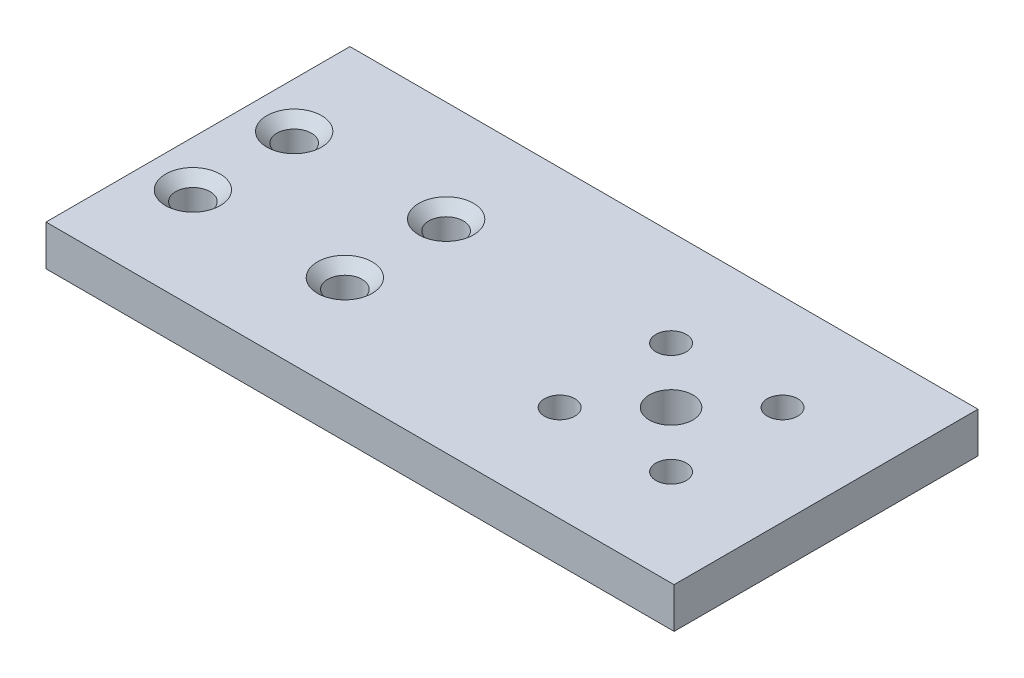
ISO-10303-21;
HEADER;
FILE_DESCRIPTION(('STEP AP214'),'2;1');
FILE_NAME('part.step','',(''),(''),'','','');
FILE_SCHEMA(('AUTOMOTIVE_DESIGN { 1 0 10303 214 1 1 1 1 }'));
ENDSEC;
DATA;
#1=APPLICATION_CONTEXT('core data for automotive mechanical design processes');
#2=APPLICATION_PROTOCOL_DEFINITION('international standard','automotive_design',2000,#1);
#3=PRODUCT_CONTEXT('',#1,'mechanical');
#4=PRODUCT('Part','Part','',(#3));
#5=PRODUCT_RELATED_PRODUCT_CATEGORY('part','',(#4));
#6=PRODUCT_DEFINITION_FORMATION('','',#4);
#7=PRODUCT_DEFINITION_CONTEXT('part definition',#1,'design');
#8=PRODUCT_DEFINITION('design','',#6,#7);
#9=PRODUCT_DEFINITION_SHAPE('','',#8);
#10=(LENGTH_UNIT() NAMED_UNIT(*) SI_UNIT(.MILLI.,.METRE.));
#11=(NAMED_UNIT(*) PLANE_ANGLE_UNIT() SI_UNIT($,.RADIAN.));
#12=(NAMED_UNIT(*) SI_UNIT($,.STERADIAN.) SOLID_ANGLE_UNIT());
#13=UNCERTAINTY_MEASURE_WITH_UNIT(LENGTH_MEASURE(1.E-05),#10,'distance_accuracy_value','');
#14=(GEOMETRIC_REPRESENTATION_CONTEXT(3) GLOBAL_UNCERTAINTY_ASSIGNED_CONTEXT((#13)) GLOBAL_UNIT_ASSIGNED_CONTEXT((#10,
#11,#12)) REPRESENTATION_CONTEXT('',''));
#15=CARTESIAN_POINT('',(0.,0.,0.));
#16=DIRECTION('',(0.,0.,1.));
#17=DIRECTION('',(1.,0.,0.));
#18=AXIS2_PLACEMENT_3D('',#15,#16,#17);
#19=CARTESIAN_POINT('',(0.,4.,0.));
#20=DIRECTION('',(0.,1.,0.));
#21=DIRECTION('',(0.,0.,1.));
#22=AXIS2_PLACEMENT_3D('',#19,#20,#21);
#23=PLANE('',#22);
#24=CARTESIAN_POINT('',(29.2031872541509,4.,5.5));
#25=DIRECTION('',(0.,1.,0.));
#26=DIRECTION('',(0.,0.,1.));
#27=AXIS2_PLACEMENT_3D('',#24,#25,#26);
#28=CIRCLE('',#27,1.5);
#29=CARTESIAN_POINT('',(29.2031872541509,4.,7.));
#30=VERTEX_POINT('',#29);
#31=EDGE_CURVE('E157',#30,#30,#28,.T.);
#32=ORIENTED_EDGE('',*,*,#31,.F.);
#33=EDGE_LOOP('',(#32));
#34=FACE_BOUND('',#33,.T.);
#35=CARTESIAN_POINT('',(40.2031872541509,4.,5.5));
#36=DIRECTION('',(0.,1.,0.));
#37=DIRECTION('',(0.,0.,1.));
#38=AXIS2_PLACEMENT_3D('',#35,#36,#37);
#39=CIRCLE('',#38,1.5);
#40=CARTESIAN_POINT('',(40.2031872541509,4.,7.));
#41=VERTEX_POINT('',#40);
#42=EDGE_CURVE('E149',#41,#41,#39,.T.);
#43=ORIENTED_EDGE('',*,*,#42,.F.);
#44=EDGE_LOOP('',(#43));
#45=FACE_BOUND('',#44,.T.);
#46=CARTESIAN_POINT('',(40.2031872541509,4.,-5.5));
#47=DIRECTION('',(0.,1.,0.));
#48=DIRECTION('',(0.,0.,1.));
#49=AXIS2_PLACEMENT_3D('',#46,#47,#48);
#50=CIRCLE('',#49,1.5);
#51=CARTESIAN_POINT('',(40.2031872541509,4.,-3.99999999999999));
#52=VERTEX_POINT('',#51);
#53=EDGE_CURVE('E141',#52,#52,#50,.T.);
#54=ORIENTED_EDGE('',*,*,#53,.F.);
#55=EDGE_LOOP('',(#54));
#56=FACE_BOUND('',#55,.T.);
#57=CARTESIAN_POINT('',(29.2031872541509,4.,-5.5));
#58=DIRECTION('',(0.,1.,0.));
#59=DIRECTION('',(0.,0.,1.));
#60=AXIS2_PLACEMENT_3D('',#57,#58,#59);
#61=CIRCLE('',#60,1.5);
#62=CARTESIAN_POINT('',(29.2031872541509,4.,-4.));
#63=VERTEX_POINT('',#62);
#64=EDGE_CURVE('E132',#63,#63,#61,.T.);
#65=ORIENTED_EDGE('',*,*,#64,.F.);
#66=EDGE_LOOP('',(#65));
#67=FACE_BOUND('',#66,.T.);
#68=CARTESIAN_POINT('',(34.7031872541509,4.,0.));
#69=DIRECTION('',(0.,1.,0.));
#70=DIRECTION('',(0.,0.,1.));
#71=AXIS2_PLACEMENT_3D('',#68,#69,#70);
#72=CIRCLE('',#71,2.15);
#73=CARTESIAN_POINT('',(34.7031872541509,4.,2.15));
#74=VERTEX_POINT('',#73);
#75=EDGE_CURVE('E136',#74,#74,#72,.T.);
#76=ORIENTED_EDGE('',*,*,#75,.F.);
#77=EDGE_LOOP('',(#76));
#78=FACE_BOUND('',#77,.T.);
#79=CARTESIAN_POINT('',(-7.5,4.,5.));
#80=DIRECTION('',(0.,1.,0.));
#81=DIRECTION('',(0.,0.,1.));
#82=AXIS2_PLACEMENT_3D('',#79,#80,#81);
#83=CIRCLE('',#82,2.69999999999999);
#84=CARTESIAN_POINT('',(-7.5,4.,7.69999999999999));
#85=VERTEX_POINT('',#84);
#86=EDGE_CURVE('E208',#85,#85,#83,.F.);
#87=ORIENTED_EDGE('',*,*,#86,.T.);
#88=EDGE_LOOP('',(#87));
#89=FACE_BOUND('',#88,.T.);
#90=CARTESIAN_POINT('',(7.5,4.,5.));
#91=DIRECTION('',(0.,1.,0.));
#92=DIRECTION('',(0.,0.,1.));
#93=AXIS2_PLACEMENT_3D('',#90,#91,#92);
#94=CIRCLE('',#93,2.70000000000001);
#95=CARTESIAN_POINT('',(7.5,4.,7.70000000000001));
#96=VERTEX_POINT('',#95);
#97=EDGE_CURVE('E204',#96,#96,#94,.F.);
#98=ORIENTED_EDGE('',*,*,#97,.T.);
#99=EDGE_LOOP('',(#98));
#100=FACE_BOUND('',#99,.T.);
#101=CARTESIAN_POINT('',(7.5,4.,-5.));
#102=DIRECTION('',(0.,1.,0.));
#103=DIRECTION('',(0.,0.,1.));
#104=AXIS2_PLACEMENT_3D('',#101,#102,#103);
#105=CIRCLE('',#104,2.70000000000001);
#106=CARTESIAN_POINT('',(7.5,4.,-2.29999999999999));
#107=VERTEX_POINT('',#106);
#108=EDGE_CURVE('E200',#107,#107,#105,.F.);
#109=ORIENTED_EDGE('',*,*,#108,.T.);
#110=EDGE_LOOP('',(#109));
#111=FACE_BOUND('',#110,.T.);
#112=CARTESIAN_POINT('',(-7.5,4.,-5.));
#113=DIRECTION('',(0.,1.,0.));
#114=DIRECTION('',(0.,0.,1.));
#115=AXIS2_PLACEMENT_3D('',#112,#113,#114);
#116=CIRCLE('',#115,2.69999999999999);
#117=CARTESIAN_POINT('',(-7.5,4.,-2.30000000000001));
#118=VERTEX_POINT('',#117);
#119=EDGE_CURVE('E196',#118,#118,#116,.F.);
#120=ORIENTED_EDGE('',*,*,#119,.T.);
#121=EDGE_LOOP('',(#120));
#122=FACE_BOUND('',#121,.T.);
#123=DIRECTION('',(0.,0.,1.));
#124=VECTOR('',#123,1.);
#125=CARTESIAN_POINT('',(-12.,4.,-14.));
#126=LINE('',#125,#124);
#127=CARTESIAN_POINT('',(-12.,4.,-15.));
#128=VERTEX_POINT('',#127);
#129=CARTESIAN_POINT('',(-12.,4.,15.));
#130=VERTEX_POINT('',#129);
#131=EDGE_CURVE('E62',#128,#130,#126,.T.);
#132=ORIENTED_EDGE('',*,*,#131,.T.);
#133=DIRECTION('',(-1.,0.,0.));
#134=VECTOR('',#133,1.);
#135=CARTESIAN_POINT('',(50.,4.,15.));
#136=LINE('',#135,#134);
#137=CARTESIAN_POINT('',(50.,4.,15.));
#138=VERTEX_POINT('',#137);
#139=EDGE_CURVE('E128',#138,#130,#136,.T.);
#140=ORIENTED_EDGE('',*,*,#139,.F.);
#141=DIRECTION('',(0.,0.,-1.));
#142=VECTOR('',#141,1.);
#143=CARTESIAN_POINT('',(50.,4.,-14.));
#144=LINE('',#143,#142);
#145=CARTESIAN_POINT('',(50.,4.,-15.));
#146=VERTEX_POINT('',#145);
#147=EDGE_CURVE('E70',#138,#146,#144,.T.);
#148=ORIENTED_EDGE('',*,*,#147,.T.);
#149=DIRECTION('',(1.,0.,0.));
#150=VECTOR('',#149,1.);
#151=CARTESIAN_POINT('',(-12.,4.,-15.));
#152=LINE('',#151,#150);
#153=EDGE_CURVE('E111',#128,#146,#152,.T.);
#154=ORIENTED_EDGE('',*,*,#153,.F.);
#155=EDGE_LOOP('',(#132,#140,#148,#154));
#156=FACE_BOUND('',#155,.T.);
#157=ADVANCED_FACE('F45',(#34,#45,#56,#67,#78,#89,#100,#111,#122,#156),#23,.T.);
#158=CARTESIAN_POINT('',(0.,0.,0.));
#159=DIRECTION('',(0.,1.,0.));
#160=DIRECTION('',(0.,0.,1.));
#161=AXIS2_PLACEMENT_3D('',#158,#159,#160);
#162=PLANE('',#161);
#163=CARTESIAN_POINT('',(29.2031872541509,0.,5.5));
#164=DIRECTION('',(0.,1.,0.));
#165=DIRECTION('',(0.,0.,1.));
#166=AXIS2_PLACEMENT_3D('',#163,#164,#165);
#167=CIRCLE('',#166,1.5);
#168=CARTESIAN_POINT('',(29.2031872541509,0.,7.));
#169=VERTEX_POINT('',#168);
#170=EDGE_CURVE('E131',#169,#169,#167,.T.);
#171=ORIENTED_EDGE('',*,*,#170,.T.);
#172=EDGE_LOOP('',(#171));
#173=FACE_BOUND('',#172,.T.);
#174=CARTESIAN_POINT('',(40.2031872541509,0.,5.5));
#175=DIRECTION('',(0.,1.,0.));
#176=DIRECTION('',(0.,0.,1.));
#177=AXIS2_PLACEMENT_3D('',#174,#175,#176);
#178=CIRCLE('',#177,1.5);
#179=CARTESIAN_POINT('',(40.2031872541509,0.,7.));
#180=VERTEX_POINT('',#179);
#181=EDGE_CURVE('E153',#180,#180,#178,.T.);
#182=ORIENTED_EDGE('',*,*,#181,.T.);
#183=EDGE_LOOP('',(#182));
#184=FACE_BOUND('',#183,.T.);
#185=CARTESIAN_POINT('',(40.2031872541509,0.,-5.5));
#186=DIRECTION('',(0.,1.,0.));
#187=DIRECTION('',(0.,0.,1.));
#188=AXIS2_PLACEMENT_3D('',#185,#186,#187);
#189=CIRCLE('',#188,1.5);
#190=CARTESIAN_POINT('',(40.2031872541509,0.,-3.99999999999999));
#191=VERTEX_POINT('',#190);
#192=EDGE_CURVE('E145',#191,#191,#189,.T.);
#193=ORIENTED_EDGE('',*,*,#192,.T.);
#194=EDGE_LOOP('',(#193));
#195=FACE_BOUND('',#194,.T.);
#196=CARTESIAN_POINT('',(29.2031872541509,0.,-5.5));
#197=DIRECTION('',(0.,1.,0.));
#198=DIRECTION('',(0.,0.,1.));
#199=AXIS2_PLACEMENT_3D('',#196,#197,#198);
#200=CIRCLE('',#199,1.5);
#201=CARTESIAN_POINT('',(29.2031872541509,0.,-4.));
#202=VERTEX_POINT('',#201);
#203=EDGE_CURVE('E137',#202,#202,#200,.T.);
#204=ORIENTED_EDGE('',*,*,#203,.T.);
#205=EDGE_LOOP('',(#204));
#206=FACE_BOUND('',#205,.T.);
#207=CARTESIAN_POINT('',(34.7031872541509,0.,0.));
#208=DIRECTION('',(0.,1.,0.));
#209=DIRECTION('',(0.,0.,1.));
#210=AXIS2_PLACEMENT_3D('',#207,#208,#209);
#211=CIRCLE('',#210,2.15);
#212=CARTESIAN_POINT('',(34.7031872541509,0.,2.15));
#213=VERTEX_POINT('',#212);
#214=EDGE_CURVE('E164',#213,#213,#211,.T.);
#215=ORIENTED_EDGE('',*,*,#214,.T.);
#216=EDGE_LOOP('',(#215));
#217=FACE_BOUND('',#216,.T.);
#218=CARTESIAN_POINT('',(-7.5,0.,5.));
#219=DIRECTION('',(0.,1.,0.));
#220=DIRECTION('',(0.,0.,1.));
#221=AXIS2_PLACEMENT_3D('',#218,#219,#220);
#222=CIRCLE('',#221,1.7);
#223=CARTESIAN_POINT('',(-7.5,0.,6.7));
#224=VERTEX_POINT('',#223);
#225=EDGE_CURVE('E181',#224,#224,#222,.T.);
#226=ORIENTED_EDGE('',*,*,#225,.T.);
#227=EDGE_LOOP('',(#226));
#228=FACE_BOUND('',#227,.T.);
#229=CARTESIAN_POINT('',(7.5,0.,-5.));
#230=DIRECTION('',(0.,1.,0.));
#231=DIRECTION('',(0.,0.,1.));
#232=AXIS2_PLACEMENT_3D('',#229,#230,#231);
#233=CIRCLE('',#232,1.7);
#234=CARTESIAN_POINT('',(7.5,0.,-3.3));
#235=VERTEX_POINT('',#234);
#236=EDGE_CURVE('E180',#235,#235,#233,.T.);
#237=ORIENTED_EDGE('',*,*,#236,.T.);
#238=EDGE_LOOP('',(#237));
#239=FACE_BOUND('',#238,.T.);
#240=CARTESIAN_POINT('',(-7.5,0.,-5.));
#241=DIRECTION('',(0.,1.,0.));
#242=DIRECTION('',(0.,0.,1.));
#243=AXIS2_PLACEMENT_3D('',#240,#241,#242);
#244=CIRCLE('',#243,1.7);
#245=CARTESIAN_POINT('',(-7.5,0.,-3.3));
#246=VERTEX_POINT('',#245);
#247=EDGE_CURVE('E97',#246,#246,#244,.T.);
#248=ORIENTED_EDGE('',*,*,#247,.T.);
#249=EDGE_LOOP('',(#248));
#250=FACE_BOUND('',#249,.T.);
#251=CARTESIAN_POINT('',(7.5,0.,5.));
#252=DIRECTION('',(0.,1.,0.));
#253=DIRECTION('',(0.,0.,1.));
#254=AXIS2_PLACEMENT_3D('',#251,#252,#253);
#255=CIRCLE('',#254,1.7);
#256=CARTESIAN_POINT('',(7.5,0.,6.7));
#257=VERTEX_POINT('',#256);
#258=EDGE_CURVE('E185',#257,#257,#255,.T.);
#259=ORIENTED_EDGE('',*,*,#258,.T.);
#260=EDGE_LOOP('',(#259));
#261=FACE_BOUND('',#260,.T.);
#262=DIRECTION('',(0.,0.,1.));
#263=VECTOR('',#262,1.);
#264=CARTESIAN_POINT('',(-12.,0.,-14.));
#265=LINE('',#264,#263);
#266=CARTESIAN_POINT('',(-12.,0.,-15.));
#267=VERTEX_POINT('',#266);
#268=CARTESIAN_POINT('',(-12.,0.,15.));
#269=VERTEX_POINT('',#268);
#270=EDGE_CURVE('E102',#267,#269,#265,.T.);
#271=ORIENTED_EDGE('',*,*,#270,.F.);
#272=DIRECTION('',(-1.,0.,0.));
#273=VECTOR('',#272,1.);
#274=CARTESIAN_POINT('',(50.,0.,-15.));
#275=LINE('',#274,#273);
#276=CARTESIAN_POINT('',(50.,0.,-15.));
#277=VERTEX_POINT('',#276);
#278=EDGE_CURVE('E100',#277,#267,#275,.T.);
#279=ORIENTED_EDGE('',*,*,#278,.F.);
#280=DIRECTION('',(0.,0.,-1.));
#281=VECTOR('',#280,1.);
#282=CARTESIAN_POINT('',(50.,0.,-14.));
#283=LINE('',#282,#281);
#284=CARTESIAN_POINT('',(50.,0.,15.));
#285=VERTEX_POINT('',#284);
#286=EDGE_CURVE('E87',#285,#277,#283,.T.);
#287=ORIENTED_EDGE('',*,*,#286,.F.);
#288=DIRECTION('',(1.,0.,0.));
#289=VECTOR('',#288,1.);
#290=CARTESIAN_POINT('',(-12.,0.,15.));
#291=LINE('',#290,#289);
#292=EDGE_CURVE('E123',#269,#285,#291,.T.);
#293=ORIENTED_EDGE('',*,*,#292,.F.);
#294=EDGE_LOOP('',(#271,#279,#287,#293));
#295=FACE_BOUND('',#294,.T.);
#296=ADVANCED_FACE('F101',(#173,#184,#195,#206,#217,#228,#239,#250,#261,#295),#162,.F.);
#297=CARTESIAN_POINT('',(7.5,0.,5.));
#298=DIRECTION('',(0.,1.,0.));
#299=DIRECTION('',(0.,0.,1.));
#300=AXIS2_PLACEMENT_3D('',#297,#298,#299);
#301=CYLINDRICAL_SURFACE('',#300,1.7);
#302=CARTESIAN_POINT('',(7.5,2.99999999999999,5.));
#303=DIRECTION('',(0.,1.,0.));
#304=DIRECTION('',(0.,0.,1.));
#305=AXIS2_PLACEMENT_3D('',#302,#303,#304);
#306=CIRCLE('',#305,1.7);
#307=CARTESIAN_POINT('',(7.5,2.99999999999999,6.7));
#308=VERTEX_POINT('',#307);
#309=EDGE_CURVE('E212',#308,#308,#306,.T.);
#310=ORIENTED_EDGE('',*,*,#309,.T.);
#311=EDGE_LOOP('',(#310));
#312=FACE_BOUND('',#311,.T.);
#313=ORIENTED_EDGE('',*,*,#258,.F.);
#314=EDGE_LOOP('',(#313));
#315=FACE_BOUND('',#314,.T.);
#316=ADVANCED_FACE('F243',(#312,#315),#301,.F.);
#317=CARTESIAN_POINT('',(-7.5,0.,-5.));
#318=DIRECTION('',(0.,1.,0.));
#319=DIRECTION('',(0.,0.,1.));
#320=AXIS2_PLACEMENT_3D('',#317,#318,#319);
#321=CYLINDRICAL_SURFACE('',#320,1.7);
#322=CARTESIAN_POINT('',(-7.5,3.,-5.));
#323=DIRECTION('',(0.,1.,0.));
#324=DIRECTION('',(0.,0.,1.));
#325=AXIS2_PLACEMENT_3D('',#322,#323,#324);
#326=CIRCLE('',#325,1.7);
#327=CARTESIAN_POINT('',(-7.5,3.,-3.3));
#328=VERTEX_POINT('',#327);
#329=EDGE_CURVE('E11',#328,#328,#326,.T.);
#330=ORIENTED_EDGE('',*,*,#329,.T.);
#331=EDGE_LOOP('',(#330));
#332=FACE_BOUND('',#331,.T.);
#333=ORIENTED_EDGE('',*,*,#247,.F.);
#334=EDGE_LOOP('',(#333));
#335=FACE_BOUND('',#334,.T.);
#336=ADVANCED_FACE('F287',(#332,#335),#321,.F.);
#337=CARTESIAN_POINT('',(7.5,0.,-5.));
#338=DIRECTION('',(0.,1.,0.));
#339=DIRECTION('',(0.,0.,1.));
#340=AXIS2_PLACEMENT_3D('',#337,#338,#339);
#341=CYLINDRICAL_SURFACE('',#340,1.7);
#342=CARTESIAN_POINT('',(7.5,2.99999999999999,-5.));
#343=DIRECTION('',(0.,1.,0.));
#344=DIRECTION('',(0.,0.,1.));
#345=AXIS2_PLACEMENT_3D('',#342,#343,#344);
#346=CIRCLE('',#345,1.7);
#347=CARTESIAN_POINT('',(7.5,2.99999999999999,-3.3));
#348=VERTEX_POINT('',#347);
#349=EDGE_CURVE('E55',#348,#348,#346,.T.);
#350=ORIENTED_EDGE('',*,*,#349,.T.);
#351=EDGE_LOOP('',(#350));
#352=FACE_BOUND('',#351,.T.);
#353=ORIENTED_EDGE('',*,*,#236,.F.);
#354=EDGE_LOOP('',(#353));
#355=FACE_BOUND('',#354,.T.);
#356=ADVANCED_FACE('F219',(#352,#355),#341,.F.);
#357=CARTESIAN_POINT('',(-7.5,0.,5.));
#358=DIRECTION('',(0.,1.,0.));
#359=DIRECTION('',(0.,0.,1.));
#360=AXIS2_PLACEMENT_3D('',#357,#358,#359);
#361=CYLINDRICAL_SURFACE('',#360,1.7);
#362=CARTESIAN_POINT('',(-7.5,3.,5.));
#363=DIRECTION('',(0.,1.,0.));
#364=DIRECTION('',(0.,0.,1.));
#365=AXIS2_PLACEMENT_3D('',#362,#363,#364);
#366=CIRCLE('',#365,1.7);
#367=CARTESIAN_POINT('',(-7.5,3.,6.7));
#368=VERTEX_POINT('',#367);
#369=EDGE_CURVE('E192',#368,#368,#366,.T.);
#370=ORIENTED_EDGE('',*,*,#369,.T.);
#371=EDGE_LOOP('',(#370));
#372=FACE_BOUND('',#371,.T.);
#373=ORIENTED_EDGE('',*,*,#225,.F.);
#374=EDGE_LOOP('',(#373));
#375=FACE_BOUND('',#374,.T.);
#376=ADVANCED_FACE('F273',(#372,#375),#361,.F.);
#377=CARTESIAN_POINT('',(50.,0.,-14.));
#378=DIRECTION('',(1.,0.,0.));
#379=DIRECTION('',(0.,0.,-1.));
#380=AXIS2_PLACEMENT_3D('',#377,#378,#379);
#381=PLANE('',#380);
#382=ORIENTED_EDGE('',*,*,#147,.F.);
#383=DIRECTION('',(0.,1.,0.));
#384=VECTOR('',#383,1.);
#385=CARTESIAN_POINT('',(50.,0.,15.));
#386=LINE('',#385,#384);
#387=EDGE_CURVE('E92',#285,#138,#386,.T.);
#388=ORIENTED_EDGE('',*,*,#387,.F.);
#389=ORIENTED_EDGE('',*,*,#286,.T.);
#390=DIRECTION('',(0.,-1.,0.));
#391=VECTOR('',#390,1.);
#392=CARTESIAN_POINT('',(50.,4.,-15.));
#393=LINE('',#392,#391);
#394=EDGE_CURVE('E91',#146,#277,#393,.T.);
#395=ORIENTED_EDGE('',*,*,#394,.F.);
#396=EDGE_LOOP('',(#382,#388,#389,#395));
#397=FACE_BOUND('',#396,.T.);
#398=ADVANCED_FACE('F89',(#397),#381,.T.);
#399=CARTESIAN_POINT('',(-12.,0.,-14.));
#400=DIRECTION('',(-1.,0.,0.));
#401=DIRECTION('',(0.,0.,1.));
#402=AXIS2_PLACEMENT_3D('',#399,#400,#401);
#403=PLANE('',#402);
#404=ORIENTED_EDGE('',*,*,#131,.F.);
#405=DIRECTION('',(0.,1.,0.));
#406=VECTOR('',#405,1.);
#407=CARTESIAN_POINT('',(-12.,0.,-15.));
#408=LINE('',#407,#406);
#409=EDGE_CURVE('E107',#267,#128,#408,.T.);
#410=ORIENTED_EDGE('',*,*,#409,.F.);
#411=ORIENTED_EDGE('',*,*,#270,.T.);
#412=DIRECTION('',(0.,-1.,0.));
#413=VECTOR('',#412,1.);
#414=CARTESIAN_POINT('',(-12.,4.,15.));
#415=LINE('',#414,#413);
#416=EDGE_CURVE('E119',#130,#269,#415,.T.);
#417=ORIENTED_EDGE('',*,*,#416,.F.);
#418=EDGE_LOOP('',(#404,#410,#411,#417));
#419=FACE_BOUND('',#418,.T.);
#420=ADVANCED_FACE('F256',(#419),#403,.T.);
#421=CARTESIAN_POINT('',(-7.5,3.,5.));
#422=DIRECTION('',(0.,1.,0.));
#423=DIRECTION('',(0.,0.,1.));
#424=AXIS2_PLACEMENT_3D('',#421,#422,#423);
#425=CONICAL_SURFACE('',#424,1.7,0.785398163397449);
#426=ORIENTED_EDGE('',*,*,#86,.F.);
#427=EDGE_LOOP('',(#426));
#428=FACE_BOUND('',#427,.T.);
#429=ORIENTED_EDGE('',*,*,#369,.F.);
#430=EDGE_LOOP('',(#429));
#431=FACE_BOUND('',#430,.T.);
#432=ADVANCED_FACE('F232',(#428,#431),#425,.F.);
#433=CARTESIAN_POINT('',(7.5,2.99999999999999,5.));
#434=DIRECTION('',(0.,1.,0.));
#435=DIRECTION('',(0.,0.,1.));
#436=AXIS2_PLACEMENT_3D('',#433,#434,#435);
#437=CONICAL_SURFACE('',#436,1.7,0.785398163397449);
#438=ORIENTED_EDGE('',*,*,#97,.F.);
#439=EDGE_LOOP('',(#438));
#440=FACE_BOUND('',#439,.T.);
#441=ORIENTED_EDGE('',*,*,#309,.F.);
#442=EDGE_LOOP('',(#441));
#443=FACE_BOUND('',#442,.T.);
#444=ADVANCED_FACE('F224',(#440,#443),#437,.F.);
#445=CARTESIAN_POINT('',(7.5,2.99999999999999,-5.));
#446=DIRECTION('',(0.,1.,0.));
#447=DIRECTION('',(0.,0.,1.));
#448=AXIS2_PLACEMENT_3D('',#445,#446,#447);
#449=CONICAL_SURFACE('',#448,1.7,0.785398163397449);
#450=ORIENTED_EDGE('',*,*,#108,.F.);
#451=EDGE_LOOP('',(#450));
#452=FACE_BOUND('',#451,.T.);
#453=ORIENTED_EDGE('',*,*,#349,.F.);
#454=EDGE_LOOP('',(#453));
#455=FACE_BOUND('',#454,.T.);
#456=ADVANCED_FACE('F222',(#452,#455),#449,.F.);
#457=CARTESIAN_POINT('',(-7.5,3.,-5.));
#458=DIRECTION('',(0.,1.,0.));
#459=DIRECTION('',(0.,0.,1.));
#460=AXIS2_PLACEMENT_3D('',#457,#458,#459);
#461=CONICAL_SURFACE('',#460,1.7,0.785398163397449);
#462=ORIENTED_EDGE('',*,*,#119,.F.);
#463=EDGE_LOOP('',(#462));
#464=FACE_BOUND('',#463,.T.);
#465=ORIENTED_EDGE('',*,*,#329,.F.);
#466=EDGE_LOOP('',(#465));
#467=FACE_BOUND('',#466,.T.);
#468=ADVANCED_FACE('F48',(#464,#467),#461,.F.);
#469=CARTESIAN_POINT('',(34.7031872541509,0.,0.));
#470=DIRECTION('',(0.,1.,0.));
#471=DIRECTION('',(0.,0.,1.));
#472=AXIS2_PLACEMENT_3D('',#469,#470,#471);
#473=CYLINDRICAL_SURFACE('',#472,2.15);
#474=ORIENTED_EDGE('',*,*,#214,.F.);
#475=EDGE_LOOP('',(#474));
#476=FACE_BOUND('',#475,.T.);
#477=ORIENTED_EDGE('',*,*,#75,.T.);
#478=EDGE_LOOP('',(#477));
#479=FACE_BOUND('',#478,.T.);
#480=ADVANCED_FACE('F230',(#476,#479),#473,.F.);
#481=CARTESIAN_POINT('',(29.2031872541509,0.,-5.5));
#482=DIRECTION('',(0.,1.,0.));
#483=DIRECTION('',(0.,0.,1.));
#484=AXIS2_PLACEMENT_3D('',#481,#482,#483);
#485=CYLINDRICAL_SURFACE('',#484,1.5);
#486=ORIENTED_EDGE('',*,*,#203,.F.);
#487=EDGE_LOOP('',(#486));
#488=FACE_BOUND('',#487,.T.);
#489=ORIENTED_EDGE('',*,*,#64,.T.);
#490=EDGE_LOOP('',(#489));
#491=FACE_BOUND('',#490,.T.);
#492=ADVANCED_FACE('F305',(#488,#491),#485,.F.);
#493=CARTESIAN_POINT('',(40.2031872541509,0.,-5.5));
#494=DIRECTION('',(0.,1.,0.));
#495=DIRECTION('',(0.,0.,1.));
#496=AXIS2_PLACEMENT_3D('',#493,#494,#495);
#497=CYLINDRICAL_SURFACE('',#496,1.5);
#498=ORIENTED_EDGE('',*,*,#192,.F.);
#499=EDGE_LOOP('',(#498));
#500=FACE_BOUND('',#499,.T.);
#501=ORIENTED_EDGE('',*,*,#53,.T.);
#502=EDGE_LOOP('',(#501));
#503=FACE_BOUND('',#502,.T.);
#504=ADVANCED_FACE('F315',(#500,#503),#497,.F.);
#505=CARTESIAN_POINT('',(40.2031872541509,0.,5.5));
#506=DIRECTION('',(0.,1.,0.));
#507=DIRECTION('',(0.,0.,1.));
#508=AXIS2_PLACEMENT_3D('',#505,#506,#507);
#509=CYLINDRICAL_SURFACE('',#508,1.5);
#510=ORIENTED_EDGE('',*,*,#181,.F.);
#511=EDGE_LOOP('',(#510));
#512=FACE_BOUND('',#511,.T.);
#513=ORIENTED_EDGE('',*,*,#42,.T.);
#514=EDGE_LOOP('',(#513));
#515=FACE_BOUND('',#514,.T.);
#516=ADVANCED_FACE('F311',(#512,#515),#509,.F.);
#517=CARTESIAN_POINT('',(29.2031872541509,0.,5.5));
#518=DIRECTION('',(0.,1.,0.));
#519=DIRECTION('',(0.,0.,1.));
#520=AXIS2_PLACEMENT_3D('',#517,#518,#519);
#521=CYLINDRICAL_SURFACE('',#520,1.5);
#522=ORIENTED_EDGE('',*,*,#170,.F.);
#523=EDGE_LOOP('',(#522));
#524=FACE_BOUND('',#523,.T.);
#525=ORIENTED_EDGE('',*,*,#31,.T.);
#526=EDGE_LOOP('',(#525));
#527=FACE_BOUND('',#526,.T.);
#528=ADVANCED_FACE('F307',(#524,#527),#521,.F.);
#529=CARTESIAN_POINT('',(0.,0.,15.));
#530=DIRECTION('',(0.,0.,1.));
#531=DIRECTION('',(1.,0.,0.));
#532=AXIS2_PLACEMENT_3D('',#529,#530,#531);
#533=PLANE('',#532);
#534=ORIENTED_EDGE('',*,*,#416,.T.);
#535=ORIENTED_EDGE('',*,*,#292,.T.);
#536=ORIENTED_EDGE('',*,*,#387,.T.);
#537=ORIENTED_EDGE('',*,*,#139,.T.);
#538=EDGE_LOOP('',(#534,#535,#536,#537));
#539=FACE_BOUND('',#538,.T.);
#540=ADVANCED_FACE('F310',(#539),#533,.T.);
#541=CARTESIAN_POINT('',(0.,0.,-15.));
#542=DIRECTION('',(0.,0.,-1.));
#543=DIRECTION('',(-1.,0.,0.));
#544=AXIS2_PLACEMENT_3D('',#541,#542,#543);
#545=PLANE('',#544);
#546=ORIENTED_EDGE('',*,*,#394,.T.);
#547=ORIENTED_EDGE('',*,*,#278,.T.);
#548=ORIENTED_EDGE('',*,*,#409,.T.);
#549=ORIENTED_EDGE('',*,*,#153,.T.);
#550=EDGE_LOOP('',(#546,#547,#548,#549));
#551=FACE_BOUND('',#550,.T.);
#552=ADVANCED_FACE('F110',(#551),#545,.T.);
#553=CLOSED_SHELL('',(#157,#296,#316,#336,#356,#376,#398,#420,#432,#444,#456,#468,#480,#492,
#504,#516,#528,#540,#552));
#554=MANIFOLD_SOLID_BREP('B2',#553);
#555=ADVANCED_BREP_SHAPE_REPRESENTATION('',(#18,#554),#14);
#556=SHAPE_DEFINITION_REPRESENTATION(#9,#555);
ENDSEC;
END-ISO-10303-21;
